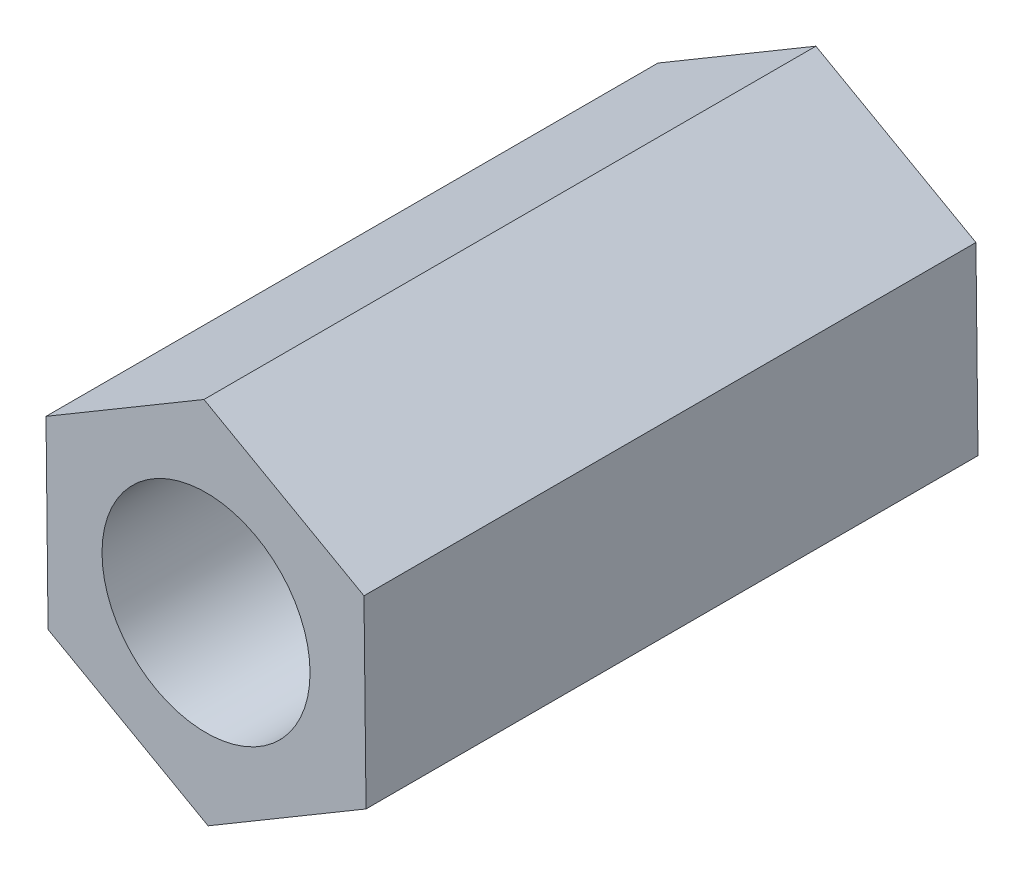
ISO-10303-21;
HEADER;
FILE_DESCRIPTION(('STEP AP214'),'2;1');
FILE_NAME('part.step','',(''),(''),'','','');
FILE_SCHEMA(('AUTOMOTIVE_DESIGN { 1 0 10303 214 1 1 1 1 }'));
ENDSEC;
DATA;
#1=APPLICATION_CONTEXT('core data for automotive mechanical design processes');
#2=APPLICATION_PROTOCOL_DEFINITION('international standard','automotive_design',2000,#1);
#3=PRODUCT_CONTEXT('',#1,'mechanical');
#4=PRODUCT('Part','Part','',(#3));
#5=PRODUCT_RELATED_PRODUCT_CATEGORY('part','',(#4));
#6=PRODUCT_DEFINITION_FORMATION('','',#4);
#7=PRODUCT_DEFINITION_CONTEXT('part definition',#1,'design');
#8=PRODUCT_DEFINITION('design','',#6,#7);
#9=PRODUCT_DEFINITION_SHAPE('','',#8);
#10=(LENGTH_UNIT() NAMED_UNIT(*) SI_UNIT(.MILLI.,.METRE.));
#11=(NAMED_UNIT(*) PLANE_ANGLE_UNIT() SI_UNIT($,.RADIAN.));
#12=(NAMED_UNIT(*) SI_UNIT($,.STERADIAN.) SOLID_ANGLE_UNIT());
#13=UNCERTAINTY_MEASURE_WITH_UNIT(LENGTH_MEASURE(1.E-05),#10,'distance_accuracy_value','');
#14=(GEOMETRIC_REPRESENTATION_CONTEXT(3) GLOBAL_UNCERTAINTY_ASSIGNED_CONTEXT((#13)) GLOBAL_UNIT_ASSIGNED_CONTEXT((#10,
#11,#12)) REPRESENTATION_CONTEXT('',''));
#15=CARTESIAN_POINT('',(0.,0.,0.));
#16=DIRECTION('',(0.,0.,1.));
#17=DIRECTION('',(1.,0.,0.));
#18=AXIS2_PLACEMENT_3D('',#15,#16,#17);
#19=CARTESIAN_POINT('',(13.0750056972715,-7.35342582307321,25.));
#20=DIRECTION('',(-0.999936349812819,-0.0112825672174294,0.));
#21=DIRECTION('',(0.0112825672174294,-0.999936349812819,0.));
#22=AXIS2_PLACEMENT_3D('',#19,#20,#21);
#23=PLANE('',#22);
#24=DIRECTION('',(-0.0112825672174294,0.999936349812819,0.));
#25=VECTOR('',#24,1.);
#26=CARTESIAN_POINT('',(13.0750056972715,-7.35342582307321,-25.));
#27=LINE('',#26,#25);
#28=CARTESIAN_POINT('',(13.0750056972715,-7.35342582307321,-25.));
#29=VERTEX_POINT('',#28);
#30=CARTESIAN_POINT('',(12.9057564162617,7.64657417692678,-25.));
#31=VERTEX_POINT('',#30);
#32=EDGE_CURVE('E116',#29,#31,#27,.T.);
#33=ORIENTED_EDGE('',*,*,#32,.T.);
#34=DIRECTION('',(0.,0.,-1.));
#35=VECTOR('',#34,1.);
#36=CARTESIAN_POINT('',(12.9057564162617,7.64657417692678,25.));
#37=LINE('',#36,#35);
#38=CARTESIAN_POINT('',(12.9057564162617,7.64657417692678,25.));
#39=VERTEX_POINT('',#38);
#40=EDGE_CURVE('E11',#39,#31,#37,.T.);
#41=ORIENTED_EDGE('',*,*,#40,.F.);
#42=DIRECTION('',(-0.0112825672174294,0.999936349812819,0.));
#43=VECTOR('',#42,1.);
#44=CARTESIAN_POINT('',(13.0750056972715,-7.35342582307321,25.));
#45=LINE('',#44,#43);
#46=CARTESIAN_POINT('',(13.0750056972715,-7.35342582307321,25.));
#47=VERTEX_POINT('',#46);
#48=EDGE_CURVE('E127',#47,#39,#45,.T.);
#49=ORIENTED_EDGE('',*,*,#48,.F.);
#50=DIRECTION('',(0.,0.,-1.));
#51=VECTOR('',#50,1.);
#52=CARTESIAN_POINT('',(13.0750056972715,-7.35342582307321,25.));
#53=LINE('',#52,#51);
#54=EDGE_CURVE('E112',#47,#29,#53,.T.);
#55=ORIENTED_EDGE('',*,*,#54,.T.);
#56=EDGE_LOOP('',(#33,#41,#49,#55));
#57=FACE_BOUND('',#56,.T.);
#58=ADVANCED_FACE('F32',(#57),#23,.F.);
#59=CARTESIAN_POINT('',(12.9057564162617,7.64657417692678,25.));
#60=DIRECTION('',(-0.49019718507621,-0.871611564714099,0.));
#61=DIRECTION('',(0.871611564714099,-0.49019718507621,0.));
#62=AXIS2_PLACEMENT_3D('',#59,#60,#61);
#63=PLANE('',#62);
#64=DIRECTION('',(-0.871611564714099,0.49019718507621,0.));
#65=VECTOR('',#64,1.);
#66=CARTESIAN_POINT('',(12.9057564162617,7.64657417692678,-25.));
#67=LINE('',#66,#65);
#68=CARTESIAN_POINT('',(-0.169249281009852,15.,-25.));
#69=VERTEX_POINT('',#68);
#70=EDGE_CURVE('E119',#31,#69,#67,.T.);
#71=ORIENTED_EDGE('',*,*,#70,.T.);
#72=DIRECTION('',(0.,0.,-1.));
#73=VECTOR('',#72,1.);
#74=CARTESIAN_POINT('',(-0.169249281009852,15.,25.));
#75=LINE('',#74,#73);
#76=CARTESIAN_POINT('',(-0.169249281009852,15.,25.));
#77=VERTEX_POINT('',#76);
#78=EDGE_CURVE('E40',#77,#69,#75,.T.);
#79=ORIENTED_EDGE('',*,*,#78,.F.);
#80=DIRECTION('',(-0.871611564714099,0.49019718507621,0.));
#81=VECTOR('',#80,1.);
#82=CARTESIAN_POINT('',(12.9057564162617,7.64657417692678,25.));
#83=LINE('',#82,#81);
#84=EDGE_CURVE('E85',#39,#77,#83,.T.);
#85=ORIENTED_EDGE('',*,*,#84,.F.);
#86=ORIENTED_EDGE('',*,*,#40,.T.);
#87=EDGE_LOOP('',(#71,#79,#85,#86));
#88=FACE_BOUND('',#87,.T.);
#89=ADVANCED_FACE('F152',(#88),#63,.F.);
#90=CARTESIAN_POINT('',(-0.169249281009852,15.,25.));
#91=DIRECTION('',(0.509739164736609,-0.860328997496669,0.));
#92=DIRECTION('',(0.860328997496669,0.509739164736609,0.));
#93=AXIS2_PLACEMENT_3D('',#90,#91,#92);
#94=PLANE('',#93);
#95=DIRECTION('',(-0.860328997496669,-0.509739164736609,0.));
#96=VECTOR('',#95,1.);
#97=CARTESIAN_POINT('',(-0.169249281009852,15.,-25.));
#98=LINE('',#97,#96);
#99=CARTESIAN_POINT('',(-13.0750056972715,7.35342582307321,-25.));
#100=VERTEX_POINT('',#99);
#101=EDGE_CURVE('E122',#69,#100,#98,.T.);
#102=ORIENTED_EDGE('',*,*,#101,.T.);
#103=DIRECTION('',(0.,0.,-1.));
#104=VECTOR('',#103,1.);
#105=CARTESIAN_POINT('',(-13.0750056972715,7.35342582307321,25.));
#106=LINE('',#105,#104);
#107=CARTESIAN_POINT('',(-13.0750056972715,7.35342582307321,25.));
#108=VERTEX_POINT('',#107);
#109=EDGE_CURVE('E107',#108,#100,#106,.T.);
#110=ORIENTED_EDGE('',*,*,#109,.F.);
#111=DIRECTION('',(-0.860328997496669,-0.509739164736609,0.));
#112=VECTOR('',#111,1.);
#113=CARTESIAN_POINT('',(-0.169249281009852,15.,25.));
#114=LINE('',#113,#112);
#115=EDGE_CURVE('E98',#77,#108,#114,.T.);
#116=ORIENTED_EDGE('',*,*,#115,.F.);
#117=ORIENTED_EDGE('',*,*,#78,.T.);
#118=EDGE_LOOP('',(#102,#110,#116,#117));
#119=FACE_BOUND('',#118,.T.);
#120=ADVANCED_FACE('F133',(#119),#94,.F.);
#121=CARTESIAN_POINT('',(-13.0750056972715,7.35342582307321,25.));
#122=DIRECTION('',(0.999936349812819,0.0112825672174293,0.));
#123=DIRECTION('',(-0.0112825672174293,0.999936349812819,0.));
#124=AXIS2_PLACEMENT_3D('',#121,#122,#123);
#125=PLANE('',#124);
#126=DIRECTION('',(0.0112825672174293,-0.999936349812819,0.));
#127=VECTOR('',#126,1.);
#128=CARTESIAN_POINT('',(-13.0750056972715,7.35342582307321,-25.));
#129=LINE('',#128,#127);
#130=CARTESIAN_POINT('',(-12.9057564162616,-7.6465741769268,-25.));
#131=VERTEX_POINT('',#130);
#132=EDGE_CURVE('E106',#100,#131,#129,.T.);
#133=ORIENTED_EDGE('',*,*,#132,.T.);
#134=DIRECTION('',(0.,0.,-1.));
#135=VECTOR('',#134,1.);
#136=CARTESIAN_POINT('',(-12.9057564162616,-7.6465741769268,25.));
#137=LINE('',#136,#135);
#138=CARTESIAN_POINT('',(-12.9057564162616,-7.6465741769268,25.));
#139=VERTEX_POINT('',#138);
#140=EDGE_CURVE('E103',#139,#131,#137,.T.);
#141=ORIENTED_EDGE('',*,*,#140,.F.);
#142=DIRECTION('',(0.0112825672174293,-0.999936349812819,0.));
#143=VECTOR('',#142,1.);
#144=CARTESIAN_POINT('',(-13.0750056972715,7.35342582307321,25.));
#145=LINE('',#144,#143);
#146=EDGE_CURVE('E92',#108,#139,#145,.T.);
#147=ORIENTED_EDGE('',*,*,#146,.F.);
#148=ORIENTED_EDGE('',*,*,#109,.T.);
#149=EDGE_LOOP('',(#133,#141,#147,#148));
#150=FACE_BOUND('',#149,.T.);
#151=ADVANCED_FACE('F104',(#150),#125,.F.);
#152=CARTESIAN_POINT('',(-12.9057564162616,-7.6465741769268,25.));
#153=DIRECTION('',(0.49019718507621,0.871611564714099,0.));
#154=DIRECTION('',(-0.871611564714099,0.49019718507621,0.));
#155=AXIS2_PLACEMENT_3D('',#152,#153,#154);
#156=PLANE('',#155);
#157=DIRECTION('',(0.871611564714099,-0.49019718507621,0.));
#158=VECTOR('',#157,1.);
#159=CARTESIAN_POINT('',(-12.9057564162616,-7.6465741769268,-25.));
#160=LINE('',#159,#158);
#161=CARTESIAN_POINT('',(0.169249281009854,-15.,-25.));
#162=VERTEX_POINT('',#161);
#163=EDGE_CURVE('E71',#131,#162,#160,.T.);
#164=ORIENTED_EDGE('',*,*,#163,.T.);
#165=DIRECTION('',(0.,0.,-1.));
#166=VECTOR('',#165,1.);
#167=CARTESIAN_POINT('',(0.169249281009854,-15.,25.));
#168=LINE('',#167,#166);
#169=CARTESIAN_POINT('',(0.169249281009854,-15.,25.));
#170=VERTEX_POINT('',#169);
#171=EDGE_CURVE('E108',#170,#162,#168,.T.);
#172=ORIENTED_EDGE('',*,*,#171,.F.);
#173=DIRECTION('',(0.871611564714099,-0.49019718507621,0.));
#174=VECTOR('',#173,1.);
#175=CARTESIAN_POINT('',(-12.9057564162616,-7.6465741769268,25.));
#176=LINE('',#175,#174);
#177=EDGE_CURVE('E96',#139,#170,#176,.T.);
#178=ORIENTED_EDGE('',*,*,#177,.F.);
#179=ORIENTED_EDGE('',*,*,#140,.T.);
#180=EDGE_LOOP('',(#164,#172,#178,#179));
#181=FACE_BOUND('',#180,.T.);
#182=ADVANCED_FACE('F110',(#181),#156,.F.);
#183=CARTESIAN_POINT('',(0.169249281009854,-15.,25.));
#184=DIRECTION('',(-0.509739164736609,0.860328997496669,0.));
#185=DIRECTION('',(-0.860328997496669,-0.509739164736609,0.));
#186=AXIS2_PLACEMENT_3D('',#183,#184,#185);
#187=PLANE('',#186);
#188=DIRECTION('',(0.86032899749667,0.509739164736609,0.));
#189=VECTOR('',#188,1.);
#190=CARTESIAN_POINT('',(0.169249281009854,-15.,-25.));
#191=LINE('',#190,#189);
#192=EDGE_CURVE('E77',#162,#29,#191,.T.);
#193=ORIENTED_EDGE('',*,*,#192,.T.);
#194=ORIENTED_EDGE('',*,*,#54,.F.);
#195=DIRECTION('',(0.86032899749667,0.509739164736609,0.));
#196=VECTOR('',#195,1.);
#197=CARTESIAN_POINT('',(0.169249281009854,-15.,25.));
#198=LINE('',#197,#196);
#199=EDGE_CURVE('E48',#170,#47,#198,.T.);
#200=ORIENTED_EDGE('',*,*,#199,.F.);
#201=ORIENTED_EDGE('',*,*,#171,.T.);
#202=EDGE_LOOP('',(#193,#194,#200,#201));
#203=FACE_BOUND('',#202,.T.);
#204=ADVANCED_FACE('F140',(#203),#187,.F.);
#205=CARTESIAN_POINT('',(0.,0.,25.));
#206=DIRECTION('',(0.,0.,1.));
#207=DIRECTION('',(1.,0.,0.));
#208=AXIS2_PLACEMENT_3D('',#205,#206,#207);
#209=PLANE('',#208);
#210=CARTESIAN_POINT('',(0.,0.,25.));
#211=DIRECTION('',(0.,0.,1.));
#212=DIRECTION('',(1.,0.,0.));
#213=AXIS2_PLACEMENT_3D('',#210,#211,#212);
#214=CIRCLE('',#213,8.5);
#215=CARTESIAN_POINT('',(8.5,0.,25.));
#216=VERTEX_POINT('',#215);
#217=EDGE_CURVE('E207',#216,#216,#214,.T.);
#218=ORIENTED_EDGE('',*,*,#217,.F.);
#219=EDGE_LOOP('',(#218));
#220=FACE_BOUND('',#219,.T.);
#221=ORIENTED_EDGE('',*,*,#48,.T.);
#222=ORIENTED_EDGE('',*,*,#84,.T.);
#223=ORIENTED_EDGE('',*,*,#115,.T.);
#224=ORIENTED_EDGE('',*,*,#146,.T.);
#225=ORIENTED_EDGE('',*,*,#177,.T.);
#226=ORIENTED_EDGE('',*,*,#199,.T.);
#227=EDGE_LOOP('',(#221,#222,#223,#224,#225,#226));
#228=FACE_BOUND('',#227,.T.);
#229=ADVANCED_FACE('F94',(#220,#228),#209,.T.);
#230=CARTESIAN_POINT('',(0.,0.,-25.));
#231=DIRECTION('',(0.,0.,1.));
#232=DIRECTION('',(1.,0.,0.));
#233=AXIS2_PLACEMENT_3D('',#230,#231,#232);
#234=PLANE('',#233);
#235=CARTESIAN_POINT('',(0.,0.,-25.));
#236=DIRECTION('',(0.,0.,1.));
#237=DIRECTION('',(1.,0.,0.));
#238=AXIS2_PLACEMENT_3D('',#235,#236,#237);
#239=CIRCLE('',#238,8.5);
#240=CARTESIAN_POINT('',(8.5,0.,-25.));
#241=VERTEX_POINT('',#240);
#242=EDGE_CURVE('E120',#241,#241,#239,.T.);
#243=ORIENTED_EDGE('',*,*,#242,.T.);
#244=EDGE_LOOP('',(#243));
#245=FACE_BOUND('',#244,.T.);
#246=ORIENTED_EDGE('',*,*,#32,.F.);
#247=ORIENTED_EDGE('',*,*,#192,.F.);
#248=ORIENTED_EDGE('',*,*,#163,.F.);
#249=ORIENTED_EDGE('',*,*,#132,.F.);
#250=ORIENTED_EDGE('',*,*,#101,.F.);
#251=ORIENTED_EDGE('',*,*,#70,.F.);
#252=EDGE_LOOP('',(#246,#247,#248,#249,#250,#251));
#253=FACE_BOUND('',#252,.T.);
#254=ADVANCED_FACE('F136',(#245,#253),#234,.F.);
#255=CARTESIAN_POINT('',(0.,0.,-25.));
#256=DIRECTION('',(0.,0.,1.));
#257=DIRECTION('',(1.,0.,0.));
#258=AXIS2_PLACEMENT_3D('',#255,#256,#257);
#259=CYLINDRICAL_SURFACE('',#258,8.5);
#260=ORIENTED_EDGE('',*,*,#242,.F.);
#261=EDGE_LOOP('',(#260));
#262=FACE_BOUND('',#261,.T.);
#263=ORIENTED_EDGE('',*,*,#217,.T.);
#264=EDGE_LOOP('',(#263));
#265=FACE_BOUND('',#264,.T.);
#266=ADVANCED_FACE('F189',(#262,#265),#259,.F.);
#267=CLOSED_SHELL('',(#58,#89,#120,#151,#182,#204,#229,#254,#266));
#268=MANIFOLD_SOLID_BREP('B2',#267);
#269=ADVANCED_BREP_SHAPE_REPRESENTATION('',(#18,#268),#14);
#270=SHAPE_DEFINITION_REPRESENTATION(#9,#269);
ENDSEC;
END-ISO-10303-21;
